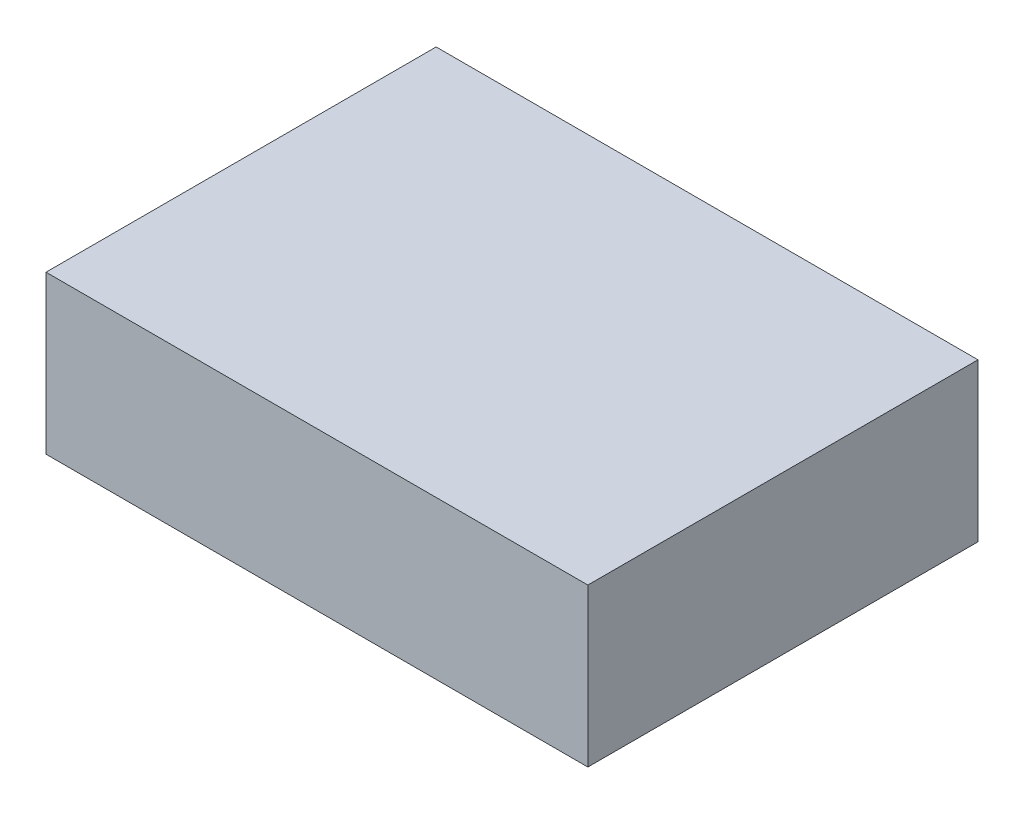
ISO-10303-21;
HEADER;
FILE_DESCRIPTION(('STEP AP214'),'2;1');
FILE_NAME('part.step','',(''),(''),'','','');
FILE_SCHEMA(('AUTOMOTIVE_DESIGN { 1 0 10303 214 1 1 1 1 }'));
ENDSEC;
DATA;
#1=APPLICATION_CONTEXT('core data for automotive mechanical design processes');
#2=APPLICATION_PROTOCOL_DEFINITION('international standard','automotive_design',2000,#1);
#3=PRODUCT_CONTEXT('',#1,'mechanical');
#4=PRODUCT('Part','Part','',(#3));
#5=PRODUCT_RELATED_PRODUCT_CATEGORY('part','',(#4));
#6=PRODUCT_DEFINITION_FORMATION('','',#4);
#7=PRODUCT_DEFINITION_CONTEXT('part definition',#1,'design');
#8=PRODUCT_DEFINITION('design','',#6,#7);
#9=PRODUCT_DEFINITION_SHAPE('','',#8);
#10=(LENGTH_UNIT() NAMED_UNIT(*) SI_UNIT(.MILLI.,.METRE.));
#11=(NAMED_UNIT(*) PLANE_ANGLE_UNIT() SI_UNIT($,.RADIAN.));
#12=(NAMED_UNIT(*) SI_UNIT($,.STERADIAN.) SOLID_ANGLE_UNIT());
#13=UNCERTAINTY_MEASURE_WITH_UNIT(LENGTH_MEASURE(1.E-05),#10,'distance_accuracy_value','');
#14=(GEOMETRIC_REPRESENTATION_CONTEXT(3) GLOBAL_UNCERTAINTY_ASSIGNED_CONTEXT((#13)) GLOBAL_UNIT_ASSIGNED_CONTEXT((#10,
#11,#12)) REPRESENTATION_CONTEXT('',''));
#15=CARTESIAN_POINT('',(0.,0.,0.));
#16=DIRECTION('',(0.,0.,1.));
#17=DIRECTION('',(1.,0.,0.));
#18=AXIS2_PLACEMENT_3D('',#15,#16,#17);
#19=CARTESIAN_POINT('',(34.925,20.32,25.146));
#20=DIRECTION('',(-1.,0.,0.));
#21=DIRECTION('',(0.,0.,1.));
#22=AXIS2_PLACEMENT_3D('',#19,#20,#21);
#23=PLANE('',#22);
#24=DIRECTION('',(0.,0.,-1.));
#25=VECTOR('',#24,1.);
#26=CARTESIAN_POINT('',(34.925,0.,25.146));
#27=LINE('',#26,#25);
#28=CARTESIAN_POINT('',(34.925,0.,25.146));
#29=VERTEX_POINT('',#28);
#30=CARTESIAN_POINT('',(34.925,0.,-25.146));
#31=VERTEX_POINT('',#30);
#32=EDGE_CURVE('E102',#29,#31,#27,.T.);
#33=ORIENTED_EDGE('',*,*,#32,.T.);
#34=DIRECTION('',(0.,-1.,0.));
#35=VECTOR('',#34,1.);
#36=CARTESIAN_POINT('',(34.925,20.32,-25.146));
#37=LINE('',#36,#35);
#38=CARTESIAN_POINT('',(34.925,20.32,-25.146));
#39=VERTEX_POINT('',#38);
#40=EDGE_CURVE('E11',#39,#31,#37,.T.);
#41=ORIENTED_EDGE('',*,*,#40,.F.);
#42=DIRECTION('',(0.,0.,-1.));
#43=VECTOR('',#42,1.);
#44=CARTESIAN_POINT('',(34.925,20.32,25.146));
#45=LINE('',#44,#43);
#46=CARTESIAN_POINT('',(34.925,20.32,25.146));
#47=VERTEX_POINT('',#46);
#48=EDGE_CURVE('E90',#47,#39,#45,.T.);
#49=ORIENTED_EDGE('',*,*,#48,.F.);
#50=DIRECTION('',(0.,-1.,0.));
#51=VECTOR('',#50,1.);
#52=CARTESIAN_POINT('',(34.925,20.32,25.146));
#53=LINE('',#52,#51);
#54=EDGE_CURVE('E98',#47,#29,#53,.T.);
#55=ORIENTED_EDGE('',*,*,#54,.T.);
#56=EDGE_LOOP('',(#33,#41,#49,#55));
#57=FACE_BOUND('',#56,.T.);
#58=ADVANCED_FACE('F39',(#57),#23,.F.);
#59=CARTESIAN_POINT('',(-34.925,20.32,-25.146));
#60=DIRECTION('',(0.,0.,1.));
#61=DIRECTION('',(1.,0.,0.));
#62=AXIS2_PLACEMENT_3D('',#59,#60,#61);
#63=PLANE('',#62);
#64=DIRECTION('',(-1.,0.,0.));
#65=VECTOR('',#64,1.);
#66=CARTESIAN_POINT('',(-34.925,0.,-25.146));
#67=LINE('',#66,#65);
#68=CARTESIAN_POINT('',(-34.925,0.,-25.146));
#69=VERTEX_POINT('',#68);
#70=EDGE_CURVE('E94',#31,#69,#67,.T.);
#71=ORIENTED_EDGE('',*,*,#70,.T.);
#72=DIRECTION('',(0.,-1.,0.));
#73=VECTOR('',#72,1.);
#74=CARTESIAN_POINT('',(-34.925,20.32,-25.146));
#75=LINE('',#74,#73);
#76=CARTESIAN_POINT('',(-34.925,20.32,-25.146));
#77=VERTEX_POINT('',#76);
#78=EDGE_CURVE('E47',#77,#69,#75,.T.);
#79=ORIENTED_EDGE('',*,*,#78,.F.);
#80=DIRECTION('',(-1.,0.,0.));
#81=VECTOR('',#80,1.);
#82=CARTESIAN_POINT('',(-34.925,20.32,-25.146));
#83=LINE('',#82,#81);
#84=EDGE_CURVE('E85',#39,#77,#83,.T.);
#85=ORIENTED_EDGE('',*,*,#84,.F.);
#86=ORIENTED_EDGE('',*,*,#40,.T.);
#87=EDGE_LOOP('',(#71,#79,#85,#86));
#88=FACE_BOUND('',#87,.T.);
#89=ADVANCED_FACE('F93',(#88),#63,.F.);
#90=CARTESIAN_POINT('',(-34.925,20.32,25.146));
#91=DIRECTION('',(1.,0.,0.));
#92=DIRECTION('',(0.,0.,-1.));
#93=AXIS2_PLACEMENT_3D('',#90,#91,#92);
#94=PLANE('',#93);
#95=DIRECTION('',(0.,0.,1.));
#96=VECTOR('',#95,1.);
#97=CARTESIAN_POINT('',(-34.925,0.,25.146));
#98=LINE('',#97,#96);
#99=CARTESIAN_POINT('',(-34.925,0.,25.146));
#100=VERTEX_POINT('',#99);
#101=EDGE_CURVE('E72',#69,#100,#98,.T.);
#102=ORIENTED_EDGE('',*,*,#101,.T.);
#103=DIRECTION('',(0.,-1.,0.));
#104=VECTOR('',#103,1.);
#105=CARTESIAN_POINT('',(-34.925,20.32,25.146));
#106=LINE('',#105,#104);
#107=CARTESIAN_POINT('',(-34.925,20.32,25.146));
#108=VERTEX_POINT('',#107);
#109=EDGE_CURVE('E95',#108,#100,#106,.T.);
#110=ORIENTED_EDGE('',*,*,#109,.F.);
#111=DIRECTION('',(0.,0.,1.));
#112=VECTOR('',#111,1.);
#113=CARTESIAN_POINT('',(-34.925,20.32,25.146));
#114=LINE('',#113,#112);
#115=EDGE_CURVE('E88',#77,#108,#114,.T.);
#116=ORIENTED_EDGE('',*,*,#115,.F.);
#117=ORIENTED_EDGE('',*,*,#78,.T.);
#118=EDGE_LOOP('',(#102,#110,#116,#117));
#119=FACE_BOUND('',#118,.T.);
#120=ADVANCED_FACE('F96',(#119),#94,.F.);
#121=CARTESIAN_POINT('',(-34.925,20.32,25.146));
#122=DIRECTION('',(0.,0.,-1.));
#123=DIRECTION('',(-1.,0.,0.));
#124=AXIS2_PLACEMENT_3D('',#121,#122,#123);
#125=PLANE('',#124);
#126=DIRECTION('',(1.,0.,0.));
#127=VECTOR('',#126,1.);
#128=CARTESIAN_POINT('',(-34.925,0.,25.146));
#129=LINE('',#128,#127);
#130=EDGE_CURVE('E78',#100,#29,#129,.T.);
#131=ORIENTED_EDGE('',*,*,#130,.T.);
#132=ORIENTED_EDGE('',*,*,#54,.F.);
#133=DIRECTION('',(1.,0.,0.));
#134=VECTOR('',#133,1.);
#135=CARTESIAN_POINT('',(-34.925,20.32,25.146));
#136=LINE('',#135,#134);
#137=EDGE_CURVE('E55',#108,#47,#136,.T.);
#138=ORIENTED_EDGE('',*,*,#137,.F.);
#139=ORIENTED_EDGE('',*,*,#109,.T.);
#140=EDGE_LOOP('',(#131,#132,#138,#139));
#141=FACE_BOUND('',#140,.T.);
#142=ADVANCED_FACE('F109',(#141),#125,.F.);
#143=CARTESIAN_POINT('',(0.,20.32,0.));
#144=DIRECTION('',(0.,-1.,0.));
#145=DIRECTION('',(0.,0.,-1.));
#146=AXIS2_PLACEMENT_3D('',#143,#144,#145);
#147=PLANE('',#146);
#148=ORIENTED_EDGE('',*,*,#48,.T.);
#149=ORIENTED_EDGE('',*,*,#84,.T.);
#150=ORIENTED_EDGE('',*,*,#115,.T.);
#151=ORIENTED_EDGE('',*,*,#137,.T.);
#152=EDGE_LOOP('',(#148,#149,#150,#151));
#153=FACE_BOUND('',#152,.T.);
#154=ADVANCED_FACE('F86',(#153),#147,.F.);
#155=CARTESIAN_POINT('',(0.,0.,0.));
#156=DIRECTION('',(0.,-1.,0.));
#157=DIRECTION('',(0.,0.,-1.));
#158=AXIS2_PLACEMENT_3D('',#155,#156,#157);
#159=PLANE('',#158);
#160=ORIENTED_EDGE('',*,*,#32,.F.);
#161=ORIENTED_EDGE('',*,*,#130,.F.);
#162=ORIENTED_EDGE('',*,*,#101,.F.);
#163=ORIENTED_EDGE('',*,*,#70,.F.);
#164=EDGE_LOOP('',(#160,#161,#162,#163));
#165=FACE_BOUND('',#164,.T.);
#166=ADVANCED_FACE('F112',(#165),#159,.T.);
#167=CLOSED_SHELL('',(#58,#89,#120,#142,#154,#166));
#168=MANIFOLD_SOLID_BREP('B2',#167);
#169=ADVANCED_BREP_SHAPE_REPRESENTATION('',(#18,#168),#14);
#170=SHAPE_DEFINITION_REPRESENTATION(#9,#169);
ENDSEC;
END-ISO-10303-21;
